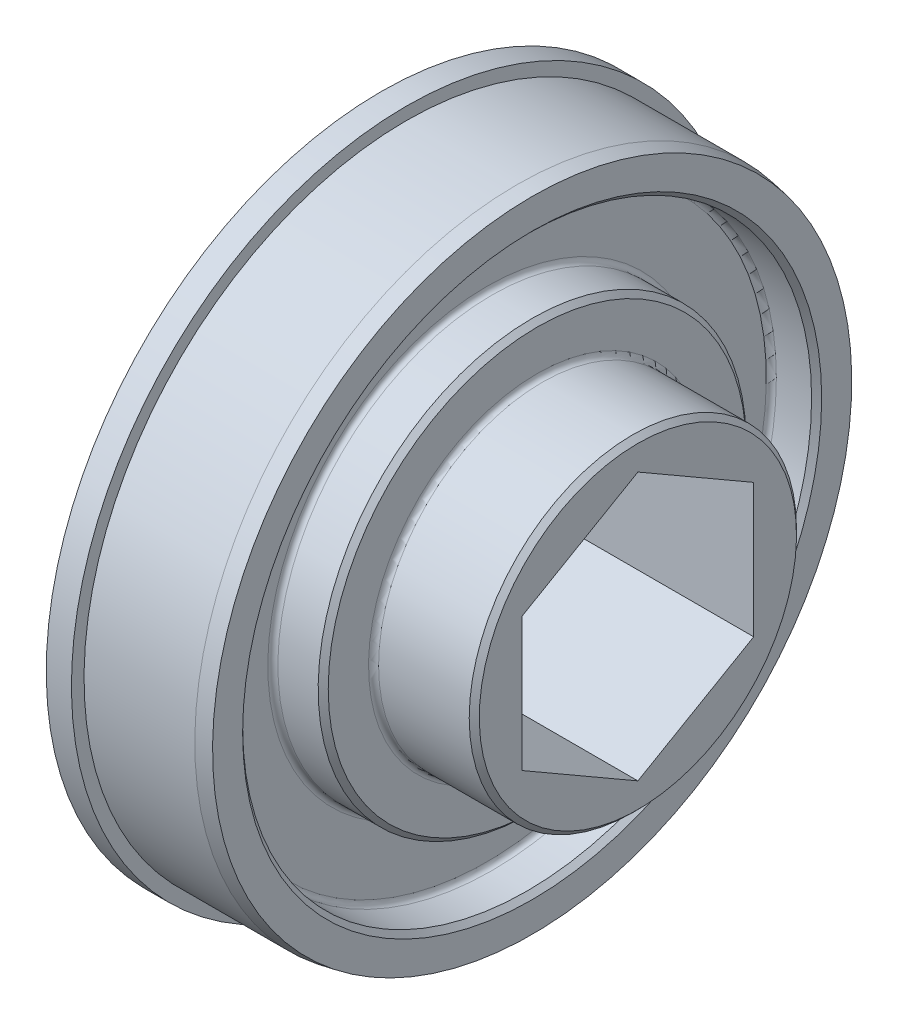
ISO-10303-21;
HEADER;
FILE_DESCRIPTION(('STEP AP214'),'2;1');
FILE_NAME('part.step','',(''),(''),'','','');
FILE_SCHEMA(('AUTOMOTIVE_DESIGN { 1 0 10303 214 1 1 1 1 }'));
ENDSEC;
DATA;
#1=APPLICATION_CONTEXT('core data for automotive mechanical design processes');
#2=APPLICATION_PROTOCOL_DEFINITION('international standard','automotive_design',2000,#1);
#3=PRODUCT_CONTEXT('',#1,'mechanical');
#4=PRODUCT('Part','Part','',(#3));
#5=PRODUCT_RELATED_PRODUCT_CATEGORY('part','',(#4));
#6=PRODUCT_DEFINITION_FORMATION('','',#4);
#7=PRODUCT_DEFINITION_CONTEXT('part definition',#1,'design');
#8=PRODUCT_DEFINITION('design','',#6,#7);
#9=PRODUCT_DEFINITION_SHAPE('','',#8);
#10=(LENGTH_UNIT() NAMED_UNIT(*) SI_UNIT(.MILLI.,.METRE.));
#11=(NAMED_UNIT(*) PLANE_ANGLE_UNIT() SI_UNIT($,.RADIAN.));
#12=(NAMED_UNIT(*) SI_UNIT($,.STERADIAN.) SOLID_ANGLE_UNIT());
#13=UNCERTAINTY_MEASURE_WITH_UNIT(LENGTH_MEASURE(1.E-05),#10,'distance_accuracy_value','');
#14=(GEOMETRIC_REPRESENTATION_CONTEXT(3) GLOBAL_UNCERTAINTY_ASSIGNED_CONTEXT((#13)) GLOBAL_UNIT_ASSIGNED_CONTEXT((#10,
#11,#12)) REPRESENTATION_CONTEXT('',''));
#15=CARTESIAN_POINT('',(0.,0.,0.));
#16=DIRECTION('',(0.,0.,1.));
#17=DIRECTION('',(1.,0.,0.));
#18=AXIS2_PLACEMENT_3D('',#15,#16,#17);
#19=CARTESIAN_POINT('',(0.,31.5,0.));
#20=DIRECTION('',(1.,0.,0.));
#21=DIRECTION('',(0.,1.,0.));
#22=AXIS2_PLACEMENT_3D('',#19,#20,#21);
#23=PLANE('',#22);
#24=DIRECTION('',(0.,0.5,0.866025403784439));
#25=VECTOR('',#24,1.);
#26=CARTESIAN_POINT('',(0.,13.2790561913614,-23.));
#27=LINE('',#26,#25);
#28=CARTESIAN_POINT('',(0.,13.2790561913614,-23.));
#29=VERTEX_POINT('',#28);
#30=CARTESIAN_POINT('',(0.,26.5581123827228,0.));
#31=VERTEX_POINT('',#30);
#32=EDGE_CURVE('E50',#29,#31,#27,.T.);
#33=ORIENTED_EDGE('',*,*,#32,.F.);
#34=DIRECTION('',(0.,1.,0.));
#35=VECTOR('',#34,1.);
#36=CARTESIAN_POINT('',(0.,-13.2790561913614,-23.));
#37=LINE('',#36,#35);
#38=CARTESIAN_POINT('',(0.,-13.2790561913614,-23.));
#39=VERTEX_POINT('',#38);
#40=EDGE_CURVE('E114',#39,#29,#37,.T.);
#41=ORIENTED_EDGE('',*,*,#40,.F.);
#42=DIRECTION('',(0.,0.5,-0.866025403784439));
#43=VECTOR('',#42,1.);
#44=CARTESIAN_POINT('',(0.,-26.5581123827228,0.));
#45=LINE('',#44,#43);
#46=CARTESIAN_POINT('',(0.,-26.5581123827228,0.));
#47=VERTEX_POINT('',#46);
#48=EDGE_CURVE('E108',#47,#39,#45,.T.);
#49=ORIENTED_EDGE('',*,*,#48,.F.);
#50=DIRECTION('',(0.,-0.5,-0.866025403784438));
#51=VECTOR('',#50,1.);
#52=CARTESIAN_POINT('',(0.,-13.2790561913614,23.));
#53=LINE('',#52,#51);
#54=CARTESIAN_POINT('',(0.,-13.2790561913614,23.));
#55=VERTEX_POINT('',#54);
#56=EDGE_CURVE('E106',#55,#47,#53,.T.);
#57=ORIENTED_EDGE('',*,*,#56,.F.);
#58=DIRECTION('',(0.,-1.,0.));
#59=VECTOR('',#58,1.);
#60=CARTESIAN_POINT('',(0.,13.2790561913614,23.));
#61=LINE('',#60,#59);
#62=CARTESIAN_POINT('',(0.,13.2790561913614,23.));
#63=VERTEX_POINT('',#62);
#64=EDGE_CURVE('E90',#63,#55,#61,.T.);
#65=ORIENTED_EDGE('',*,*,#64,.F.);
#66=DIRECTION('',(0.,-0.5,0.866025403784439));
#67=VECTOR('',#66,1.);
#68=CARTESIAN_POINT('',(0.,26.5581123827228,0.));
#69=LINE('',#68,#67);
#70=EDGE_CURVE('E99',#31,#63,#69,.T.);
#71=ORIENTED_EDGE('',*,*,#70,.F.);
#72=EDGE_LOOP('',(#33,#41,#49,#57,#65,#71));
#73=FACE_BOUND('',#72,.T.);
#74=CARTESIAN_POINT('',(0.,0.,0.));
#75=DIRECTION('',(1.,0.,0.));
#76=DIRECTION('',(0.,1.,0.));
#77=AXIS2_PLACEMENT_3D('',#74,#75,#76);
#78=CIRCLE('',#77,31.5);
#79=CARTESIAN_POINT('',(0.,31.5,0.));
#80=VERTEX_POINT('',#79);
#81=EDGE_CURVE('E215',#80,#80,#78,.T.);
#82=ORIENTED_EDGE('',*,*,#81,.T.);
#83=EDGE_LOOP('',(#82));
#84=FACE_BOUND('',#83,.T.);
#85=ADVANCED_FACE('F36',(#73,#84),#23,.T.);
#86=CARTESIAN_POINT('',(0.,0.,0.));
#87=DIRECTION('',(-1.,0.,0.));
#88=DIRECTION('',(0.,-1.,0.));
#89=AXIS2_PLACEMENT_3D('',#86,#87,#88);
#90=CONICAL_SURFACE('',#89,31.5,0.785398163397447);
#91=CARTESIAN_POINT('',(-0.999999999999992,0.,0.));
#92=DIRECTION('',(1.,0.,0.));
#93=DIRECTION('',(0.,1.,0.));
#94=AXIS2_PLACEMENT_3D('',#91,#92,#93);
#95=CIRCLE('',#94,32.5);
#96=CARTESIAN_POINT('',(-0.999999999999997,32.5,0.));
#97=VERTEX_POINT('',#96);
#98=EDGE_CURVE('E212',#97,#97,#95,.T.);
#99=ORIENTED_EDGE('',*,*,#98,.T.);
#100=EDGE_LOOP('',(#99));
#101=FACE_BOUND('',#100,.T.);
#102=ORIENTED_EDGE('',*,*,#81,.F.);
#103=EDGE_LOOP('',(#102));
#104=FACE_BOUND('',#103,.T.);
#105=ADVANCED_FACE('F250',(#101,#104),#90,.T.);
#106=CARTESIAN_POINT('',(0.,0.,0.));
#107=DIRECTION('',(1.,0.,0.));
#108=DIRECTION('',(0.,1.,0.));
#109=AXIS2_PLACEMENT_3D('',#106,#107,#108);
#110=CYLINDRICAL_SURFACE('',#109,32.5);
#111=CARTESIAN_POINT('',(-19.,0.,0.));
#112=DIRECTION('',(1.,0.,0.));
#113=DIRECTION('',(0.,1.,0.));
#114=AXIS2_PLACEMENT_3D('',#111,#112,#113);
#115=CIRCLE('',#114,32.5);
#116=CARTESIAN_POINT('',(-19.,32.5,0.));
#117=VERTEX_POINT('',#116);
#118=EDGE_CURVE('E209',#117,#117,#115,.T.);
#119=ORIENTED_EDGE('',*,*,#118,.T.);
#120=EDGE_LOOP('',(#119));
#121=FACE_BOUND('',#120,.T.);
#122=ORIENTED_EDGE('',*,*,#98,.F.);
#123=EDGE_LOOP('',(#122));
#124=FACE_BOUND('',#123,.T.);
#125=ADVANCED_FACE('F254',(#121,#124),#110,.T.);
#126=CARTESIAN_POINT('',(-19.,0.,0.));
#127=DIRECTION('',(1.,0.,0.));
#128=DIRECTION('',(0.,1.,0.));
#129=AXIS2_PLACEMENT_3D('',#126,#127,#128);
#130=TOROIDAL_SURFACE('',#129,33.5,1.);
#131=CARTESIAN_POINT('',(-20.,0.,0.));
#132=DIRECTION('',(1.,0.,0.));
#133=DIRECTION('',(0.,1.,0.));
#134=AXIS2_PLACEMENT_3D('',#131,#132,#133);
#135=CIRCLE('',#134,33.5);
#136=CARTESIAN_POINT('',(-20.,33.5,0.));
#137=VERTEX_POINT('',#136);
#138=EDGE_CURVE('E206',#137,#137,#135,.T.);
#139=ORIENTED_EDGE('',*,*,#138,.T.);
#140=EDGE_LOOP('',(#139));
#141=FACE_BOUND('',#140,.T.);
#142=ORIENTED_EDGE('',*,*,#118,.F.);
#143=EDGE_LOOP('',(#142));
#144=FACE_BOUND('',#143,.T.);
#145=ADVANCED_FACE('F259',(#141,#144),#130,.F.);
#146=CARTESIAN_POINT('',(-20.,41.5,0.));
#147=DIRECTION('',(1.,0.,0.));
#148=DIRECTION('',(0.,1.,0.));
#149=AXIS2_PLACEMENT_3D('',#146,#147,#148);
#150=PLANE('',#149);
#151=CARTESIAN_POINT('',(-20.,0.,0.));
#152=DIRECTION('',(1.,0.,0.));
#153=DIRECTION('',(0.,1.,0.));
#154=AXIS2_PLACEMENT_3D('',#151,#152,#153);
#155=CIRCLE('',#154,41.5);
#156=CARTESIAN_POINT('',(-20.,41.5,0.));
#157=VERTEX_POINT('',#156);
#158=EDGE_CURVE('E203',#157,#157,#155,.T.);
#159=ORIENTED_EDGE('',*,*,#158,.T.);
#160=EDGE_LOOP('',(#159));
#161=FACE_BOUND('',#160,.T.);
#162=ORIENTED_EDGE('',*,*,#138,.F.);
#163=EDGE_LOOP('',(#162));
#164=FACE_BOUND('',#163,.T.);
#165=ADVANCED_FACE('F266',(#161,#164),#150,.T.);
#166=CARTESIAN_POINT('',(-20.,0.,0.));
#167=DIRECTION('',(-1.,0.,0.));
#168=DIRECTION('',(0.,-1.,0.));
#169=AXIS2_PLACEMENT_3D('',#166,#167,#168);
#170=CONICAL_SURFACE('',#169,41.5,0.785398163397443);
#171=CARTESIAN_POINT('',(-21.,0.,0.));
#172=DIRECTION('',(1.,0.,0.));
#173=DIRECTION('',(0.,1.,0.));
#174=AXIS2_PLACEMENT_3D('',#171,#172,#173);
#175=CIRCLE('',#174,42.5);
#176=CARTESIAN_POINT('',(-21.,42.5,0.));
#177=VERTEX_POINT('',#176);
#178=EDGE_CURVE('E200',#177,#177,#175,.T.);
#179=ORIENTED_EDGE('',*,*,#178,.T.);
#180=EDGE_LOOP('',(#179));
#181=FACE_BOUND('',#180,.T.);
#182=ORIENTED_EDGE('',*,*,#158,.F.);
#183=EDGE_LOOP('',(#182));
#184=FACE_BOUND('',#183,.T.);
#185=ADVANCED_FACE('F270',(#181,#184),#170,.T.);
#186=CARTESIAN_POINT('',(0.,0.,0.));
#187=DIRECTION('',(1.,0.,0.));
#188=DIRECTION('',(0.,1.,0.));
#189=AXIS2_PLACEMENT_3D('',#186,#187,#188);
#190=CYLINDRICAL_SURFACE('',#189,42.5);
#191=CARTESIAN_POINT('',(-29.,0.,0.));
#192=DIRECTION('',(1.,0.,0.));
#193=DIRECTION('',(0.,1.,0.));
#194=AXIS2_PLACEMENT_3D('',#191,#192,#193);
#195=CIRCLE('',#194,42.5);
#196=CARTESIAN_POINT('',(-29.,42.5,0.));
#197=VERTEX_POINT('',#196);
#198=EDGE_CURVE('E197',#197,#197,#195,.T.);
#199=ORIENTED_EDGE('',*,*,#198,.T.);
#200=EDGE_LOOP('',(#199));
#201=FACE_BOUND('',#200,.T.);
#202=ORIENTED_EDGE('',*,*,#178,.F.);
#203=EDGE_LOOP('',(#202));
#204=FACE_BOUND('',#203,.T.);
#205=ADVANCED_FACE('F274',(#201,#204),#190,.T.);
#206=CARTESIAN_POINT('',(-29.,0.,0.));
#207=DIRECTION('',(1.,0.,0.));
#208=DIRECTION('',(0.,1.,0.));
#209=AXIS2_PLACEMENT_3D('',#206,#207,#208);
#210=TOROIDAL_SURFACE('',#209,43.5,1.);
#211=CARTESIAN_POINT('',(-30.,0.,0.));
#212=DIRECTION('',(1.,0.,0.));
#213=DIRECTION('',(0.,1.,0.));
#214=AXIS2_PLACEMENT_3D('',#211,#212,#213);
#215=CIRCLE('',#214,43.5);
#216=CARTESIAN_POINT('',(-30.,43.5,0.));
#217=VERTEX_POINT('',#216);
#218=EDGE_CURVE('E194',#217,#217,#215,.T.);
#219=ORIENTED_EDGE('',*,*,#218,.T.);
#220=EDGE_LOOP('',(#219));
#221=FACE_BOUND('',#220,.T.);
#222=ORIENTED_EDGE('',*,*,#198,.F.);
#223=EDGE_LOOP('',(#222));
#224=FACE_BOUND('',#223,.T.);
#225=ADVANCED_FACE('F278',(#221,#224),#210,.F.);
#226=CARTESIAN_POINT('',(-30.,55.5,0.));
#227=DIRECTION('',(1.,0.,0.));
#228=DIRECTION('',(0.,1.,0.));
#229=AXIS2_PLACEMENT_3D('',#226,#227,#228);
#230=PLANE('',#229);
#231=CARTESIAN_POINT('',(-30.,0.,0.));
#232=DIRECTION('',(1.,0.,0.));
#233=DIRECTION('',(0.,1.,0.));
#234=AXIS2_PLACEMENT_3D('',#231,#232,#233);
#235=CIRCLE('',#234,55.5);
#236=CARTESIAN_POINT('',(-30.,55.5,0.));
#237=VERTEX_POINT('',#236);
#238=EDGE_CURVE('E191',#237,#237,#235,.T.);
#239=ORIENTED_EDGE('',*,*,#238,.T.);
#240=EDGE_LOOP('',(#239));
#241=FACE_BOUND('',#240,.T.);
#242=ORIENTED_EDGE('',*,*,#218,.F.);
#243=EDGE_LOOP('',(#242));
#244=FACE_BOUND('',#243,.T.);
#245=ADVANCED_FACE('F282',(#241,#244),#230,.T.);
#246=CARTESIAN_POINT('',(-29.,0.,0.));
#247=DIRECTION('',(1.,0.,0.));
#248=DIRECTION('',(0.,1.,0.));
#249=AXIS2_PLACEMENT_3D('',#246,#247,#248);
#250=TOROIDAL_SURFACE('',#249,55.5,1.);
#251=CARTESIAN_POINT('',(-29.,0.,0.));
#252=DIRECTION('',(1.,0.,0.));
#253=DIRECTION('',(0.,1.,0.));
#254=AXIS2_PLACEMENT_3D('',#251,#252,#253);
#255=CIRCLE('',#254,56.5);
#256=CARTESIAN_POINT('',(-29.,56.5,0.));
#257=VERTEX_POINT('',#256);
#258=EDGE_CURVE('E188',#257,#257,#255,.T.);
#259=ORIENTED_EDGE('',*,*,#258,.T.);
#260=EDGE_LOOP('',(#259));
#261=FACE_BOUND('',#260,.T.);
#262=ORIENTED_EDGE('',*,*,#238,.F.);
#263=EDGE_LOOP('',(#262));
#264=FACE_BOUND('',#263,.T.);
#265=ADVANCED_FACE('F286',(#261,#264),#250,.F.);
#266=CARTESIAN_POINT('',(0.,0.,0.));
#267=DIRECTION('',(1.,0.,0.));
#268=DIRECTION('',(0.,1.,0.));
#269=AXIS2_PLACEMENT_3D('',#266,#267,#268);
#270=CYLINDRICAL_SURFACE('',#269,56.5);
#271=CARTESIAN_POINT('',(-22.,0.,0.));
#272=DIRECTION('',(1.,0.,0.));
#273=DIRECTION('',(0.,1.,0.));
#274=AXIS2_PLACEMENT_3D('',#271,#272,#273);
#275=CIRCLE('',#274,56.5);
#276=CARTESIAN_POINT('',(-22.,56.5,0.));
#277=VERTEX_POINT('',#276);
#278=EDGE_CURVE('E185',#277,#277,#275,.T.);
#279=ORIENTED_EDGE('',*,*,#278,.T.);
#280=EDGE_LOOP('',(#279));
#281=FACE_BOUND('',#280,.T.);
#282=ORIENTED_EDGE('',*,*,#258,.F.);
#283=EDGE_LOOP('',(#282));
#284=FACE_BOUND('',#283,.T.);
#285=ADVANCED_FACE('F290',(#281,#284),#270,.F.);
#286=CARTESIAN_POINT('',(-22.,0.,0.));
#287=DIRECTION('',(1.,0.,0.));
#288=DIRECTION('',(0.,1.,0.));
#289=AXIS2_PLACEMENT_3D('',#286,#287,#288);
#290=CONICAL_SURFACE('',#289,56.5,0.785398163397445);
#291=CARTESIAN_POINT('',(-21.,0.,0.));
#292=DIRECTION('',(1.,0.,0.));
#293=DIRECTION('',(0.,1.,0.));
#294=AXIS2_PLACEMENT_3D('',#291,#292,#293);
#295=CIRCLE('',#294,57.5);
#296=CARTESIAN_POINT('',(-21.,57.5,0.));
#297=VERTEX_POINT('',#296);
#298=EDGE_CURVE('E182',#297,#297,#295,.T.);
#299=ORIENTED_EDGE('',*,*,#298,.T.);
#300=EDGE_LOOP('',(#299));
#301=FACE_BOUND('',#300,.T.);
#302=ORIENTED_EDGE('',*,*,#278,.F.);
#303=EDGE_LOOP('',(#302));
#304=FACE_BOUND('',#303,.T.);
#305=ADVANCED_FACE('F294',(#301,#304),#290,.F.);
#306=CARTESIAN_POINT('',(-21.,63.4710190578746,0.));
#307=DIRECTION('',(1.,0.,0.));
#308=DIRECTION('',(0.,1.,0.));
#309=AXIS2_PLACEMENT_3D('',#306,#307,#308);
#310=PLANE('',#309);
#311=CARTESIAN_POINT('',(-21.,0.,0.));
#312=DIRECTION('',(1.,0.,0.));
#313=DIRECTION('',(0.,1.,0.));
#314=AXIS2_PLACEMENT_3D('',#311,#312,#313);
#315=CIRCLE('',#314,63.4710190578746);
#316=CARTESIAN_POINT('',(-21.,63.4710190578746,0.));
#317=VERTEX_POINT('',#316);
#318=EDGE_CURVE('E179',#317,#317,#315,.T.);
#319=ORIENTED_EDGE('',*,*,#318,.T.);
#320=EDGE_LOOP('',(#319));
#321=FACE_BOUND('',#320,.T.);
#322=ORIENTED_EDGE('',*,*,#298,.F.);
#323=EDGE_LOOP('',(#322));
#324=FACE_BOUND('',#323,.T.);
#325=ADVANCED_FACE('F298',(#321,#324),#310,.T.);
#326=CARTESIAN_POINT('',(-21.,0.,0.));
#327=DIRECTION('',(-1.,0.,0.));
#328=DIRECTION('',(0.,-1.,0.));
#329=AXIS2_PLACEMENT_3D('',#326,#327,#328);
#330=CONICAL_SURFACE('',#329,63.4710190578746,0.174532925199431);
#331=CARTESIAN_POINT('',(-24.,0.,0.));
#332=DIRECTION('',(1.,0.,0.));
#333=DIRECTION('',(0.,1.,0.));
#334=AXIS2_PLACEMENT_3D('',#331,#332,#333);
#335=CIRCLE('',#334,64.);
#336=CARTESIAN_POINT('',(-24.,64.,0.));
#337=VERTEX_POINT('',#336);
#338=EDGE_CURVE('E176',#337,#337,#335,.T.);
#339=ORIENTED_EDGE('',*,*,#338,.T.);
#340=EDGE_LOOP('',(#339));
#341=FACE_BOUND('',#340,.T.);
#342=ORIENTED_EDGE('',*,*,#318,.F.);
#343=EDGE_LOOP('',(#342));
#344=FACE_BOUND('',#343,.T.);
#345=ADVANCED_FACE('F302',(#341,#344),#330,.T.);
#346=CARTESIAN_POINT('',(0.,0.,0.));
#347=DIRECTION('',(1.,0.,0.));
#348=DIRECTION('',(0.,1.,0.));
#349=AXIS2_PLACEMENT_3D('',#346,#347,#348);
#350=CYLINDRICAL_SURFACE('',#349,64.);
#351=CARTESIAN_POINT('',(-46.,0.,0.));
#352=DIRECTION('',(1.,0.,0.));
#353=DIRECTION('',(0.,1.,0.));
#354=AXIS2_PLACEMENT_3D('',#351,#352,#353);
#355=CIRCLE('',#354,64.);
#356=CARTESIAN_POINT('',(-46.,64.,0.));
#357=VERTEX_POINT('',#356);
#358=EDGE_CURVE('E173',#357,#357,#355,.T.);
#359=ORIENTED_EDGE('',*,*,#358,.T.);
#360=EDGE_LOOP('',(#359));
#361=FACE_BOUND('',#360,.T.);
#362=ORIENTED_EDGE('',*,*,#338,.F.);
#363=EDGE_LOOP('',(#362));
#364=FACE_BOUND('',#363,.T.);
#365=ADVANCED_FACE('F306',(#361,#364),#350,.T.);
#366=CARTESIAN_POINT('',(-46.,66.5,0.));
#367=DIRECTION('',(1.,0.,0.));
#368=DIRECTION('',(0.,1.,0.));
#369=AXIS2_PLACEMENT_3D('',#366,#367,#368);
#370=PLANE('',#369);
#371=CARTESIAN_POINT('',(-46.,0.,0.));
#372=DIRECTION('',(1.,0.,0.));
#373=DIRECTION('',(0.,1.,0.));
#374=AXIS2_PLACEMENT_3D('',#371,#372,#373);
#375=CIRCLE('',#374,66.5);
#376=CARTESIAN_POINT('',(-46.,66.5,0.));
#377=VERTEX_POINT('',#376);
#378=EDGE_CURVE('E170',#377,#377,#375,.T.);
#379=ORIENTED_EDGE('',*,*,#378,.T.);
#380=EDGE_LOOP('',(#379));
#381=FACE_BOUND('',#380,.T.);
#382=ORIENTED_EDGE('',*,*,#358,.F.);
#383=EDGE_LOOP('',(#382));
#384=FACE_BOUND('',#383,.T.);
#385=ADVANCED_FACE('F310',(#381,#384),#370,.T.);
#386=CARTESIAN_POINT('',(0.,0.,0.));
#387=DIRECTION('',(1.,0.,0.));
#388=DIRECTION('',(0.,1.,0.));
#389=AXIS2_PLACEMENT_3D('',#386,#387,#388);
#390=CYLINDRICAL_SURFACE('',#389,66.5);
#391=CARTESIAN_POINT('',(-51.,0.,0.));
#392=DIRECTION('',(1.,0.,0.));
#393=DIRECTION('',(0.,1.,0.));
#394=AXIS2_PLACEMENT_3D('',#391,#392,#393);
#395=CIRCLE('',#394,66.5);
#396=CARTESIAN_POINT('',(-51.,66.5,0.));
#397=VERTEX_POINT('',#396);
#398=EDGE_CURVE('E167',#397,#397,#395,.T.);
#399=ORIENTED_EDGE('',*,*,#398,.T.);
#400=EDGE_LOOP('',(#399));
#401=FACE_BOUND('',#400,.T.);
#402=ORIENTED_EDGE('',*,*,#378,.F.);
#403=EDGE_LOOP('',(#402));
#404=FACE_BOUND('',#403,.T.);
#405=ADVANCED_FACE('F314',(#401,#404),#390,.T.);
#406=CARTESIAN_POINT('',(-51.,57.5,0.));
#407=DIRECTION('',(-1.,0.,0.));
#408=DIRECTION('',(0.,-1.,0.));
#409=AXIS2_PLACEMENT_3D('',#406,#407,#408);
#410=PLANE('',#409);
#411=CARTESIAN_POINT('',(-51.,0.,0.));
#412=DIRECTION('',(1.,0.,0.));
#413=DIRECTION('',(0.,1.,0.));
#414=AXIS2_PLACEMENT_3D('',#411,#412,#413);
#415=CIRCLE('',#414,57.5);
#416=CARTESIAN_POINT('',(-51.,57.5,0.));
#417=VERTEX_POINT('',#416);
#418=EDGE_CURVE('E164',#417,#417,#415,.T.);
#419=ORIENTED_EDGE('',*,*,#418,.T.);
#420=EDGE_LOOP('',(#419));
#421=FACE_BOUND('',#420,.T.);
#422=ORIENTED_EDGE('',*,*,#398,.F.);
#423=EDGE_LOOP('',(#422));
#424=FACE_BOUND('',#423,.T.);
#425=ADVANCED_FACE('F318',(#421,#424),#410,.T.);
#426=CARTESIAN_POINT('',(-51.,0.,0.));
#427=DIRECTION('',(-1.,0.,0.));
#428=DIRECTION('',(0.,-1.,0.));
#429=AXIS2_PLACEMENT_3D('',#426,#427,#428);
#430=CONICAL_SURFACE('',#429,57.5,0.785398163397438);
#431=CARTESIAN_POINT('',(-50.,0.,0.));
#432=DIRECTION('',(1.,0.,0.));
#433=DIRECTION('',(0.,1.,0.));
#434=AXIS2_PLACEMENT_3D('',#431,#432,#433);
#435=CIRCLE('',#434,56.5);
#436=CARTESIAN_POINT('',(-50.,56.5,0.));
#437=VERTEX_POINT('',#436);
#438=EDGE_CURVE('E161',#437,#437,#435,.T.);
#439=ORIENTED_EDGE('',*,*,#438,.T.);
#440=EDGE_LOOP('',(#439));
#441=FACE_BOUND('',#440,.T.);
#442=ORIENTED_EDGE('',*,*,#418,.F.);
#443=EDGE_LOOP('',(#442));
#444=FACE_BOUND('',#443,.T.);
#445=ADVANCED_FACE('F322',(#441,#444),#430,.F.);
#446=CARTESIAN_POINT('',(0.,0.,0.));
#447=DIRECTION('',(1.,0.,0.));
#448=DIRECTION('',(0.,1.,0.));
#449=AXIS2_PLACEMENT_3D('',#446,#447,#448);
#450=CYLINDRICAL_SURFACE('',#449,56.5);
#451=CARTESIAN_POINT('',(-43.,0.,0.));
#452=DIRECTION('',(1.,0.,0.));
#453=DIRECTION('',(0.,1.,0.));
#454=AXIS2_PLACEMENT_3D('',#451,#452,#453);
#455=CIRCLE('',#454,56.5);
#456=CARTESIAN_POINT('',(-43.,56.5,0.));
#457=VERTEX_POINT('',#456);
#458=EDGE_CURVE('E158',#457,#457,#455,.T.);
#459=ORIENTED_EDGE('',*,*,#458,.T.);
#460=EDGE_LOOP('',(#459));
#461=FACE_BOUND('',#460,.T.);
#462=ORIENTED_EDGE('',*,*,#438,.F.);
#463=EDGE_LOOP('',(#462));
#464=FACE_BOUND('',#463,.T.);
#465=ADVANCED_FACE('F326',(#461,#464),#450,.F.);
#466=CARTESIAN_POINT('',(-43.,0.,0.));
#467=DIRECTION('',(1.,0.,0.));
#468=DIRECTION('',(0.,1.,0.));
#469=AXIS2_PLACEMENT_3D('',#466,#467,#468);
#470=TOROIDAL_SURFACE('',#469,55.5,1.);
#471=CARTESIAN_POINT('',(-42.,0.,0.));
#472=DIRECTION('',(1.,0.,0.));
#473=DIRECTION('',(0.,1.,0.));
#474=AXIS2_PLACEMENT_3D('',#471,#472,#473);
#475=CIRCLE('',#474,55.5);
#476=CARTESIAN_POINT('',(-42.,55.5,0.));
#477=VERTEX_POINT('',#476);
#478=EDGE_CURVE('E155',#477,#477,#475,.T.);
#479=ORIENTED_EDGE('',*,*,#478,.T.);
#480=EDGE_LOOP('',(#479));
#481=FACE_BOUND('',#480,.T.);
#482=ORIENTED_EDGE('',*,*,#458,.F.);
#483=EDGE_LOOP('',(#482));
#484=FACE_BOUND('',#483,.T.);
#485=ADVANCED_FACE('F330',(#481,#484),#470,.F.);
#486=CARTESIAN_POINT('',(-42.,43.5,0.));
#487=DIRECTION('',(-1.,0.,0.));
#488=DIRECTION('',(0.,-1.,0.));
#489=AXIS2_PLACEMENT_3D('',#486,#487,#488);
#490=PLANE('',#489);
#491=CARTESIAN_POINT('',(-42.,0.,0.));
#492=DIRECTION('',(1.,0.,0.));
#493=DIRECTION('',(0.,1.,0.));
#494=AXIS2_PLACEMENT_3D('',#491,#492,#493);
#495=CIRCLE('',#494,43.5);
#496=CARTESIAN_POINT('',(-42.,43.5,0.));
#497=VERTEX_POINT('',#496);
#498=EDGE_CURVE('E152',#497,#497,#495,.T.);
#499=ORIENTED_EDGE('',*,*,#498,.T.);
#500=EDGE_LOOP('',(#499));
#501=FACE_BOUND('',#500,.T.);
#502=ORIENTED_EDGE('',*,*,#478,.F.);
#503=EDGE_LOOP('',(#502));
#504=FACE_BOUND('',#503,.T.);
#505=ADVANCED_FACE('F334',(#501,#504),#490,.T.);
#506=CARTESIAN_POINT('',(-43.,0.,0.));
#507=DIRECTION('',(1.,0.,0.));
#508=DIRECTION('',(0.,1.,0.));
#509=AXIS2_PLACEMENT_3D('',#506,#507,#508);
#510=TOROIDAL_SURFACE('',#509,43.5,1.);
#511=CARTESIAN_POINT('',(-43.,0.,0.));
#512=DIRECTION('',(1.,0.,0.));
#513=DIRECTION('',(0.,1.,0.));
#514=AXIS2_PLACEMENT_3D('',#511,#512,#513);
#515=CIRCLE('',#514,42.5);
#516=CARTESIAN_POINT('',(-43.,42.5,0.));
#517=VERTEX_POINT('',#516);
#518=EDGE_CURVE('E149',#517,#517,#515,.T.);
#519=ORIENTED_EDGE('',*,*,#518,.T.);
#520=EDGE_LOOP('',(#519));
#521=FACE_BOUND('',#520,.T.);
#522=ORIENTED_EDGE('',*,*,#498,.F.);
#523=EDGE_LOOP('',(#522));
#524=FACE_BOUND('',#523,.T.);
#525=ADVANCED_FACE('F338',(#521,#524),#510,.F.);
#526=CARTESIAN_POINT('',(0.,0.,0.));
#527=DIRECTION('',(1.,0.,0.));
#528=DIRECTION('',(0.,1.,0.));
#529=AXIS2_PLACEMENT_3D('',#526,#527,#528);
#530=CYLINDRICAL_SURFACE('',#529,42.5);
#531=CARTESIAN_POINT('',(-51.,0.,0.));
#532=DIRECTION('',(1.,0.,0.));
#533=DIRECTION('',(0.,1.,0.));
#534=AXIS2_PLACEMENT_3D('',#531,#532,#533);
#535=CIRCLE('',#534,42.5);
#536=CARTESIAN_POINT('',(-51.,42.5,0.));
#537=VERTEX_POINT('',#536);
#538=EDGE_CURVE('E146',#537,#537,#535,.T.);
#539=ORIENTED_EDGE('',*,*,#538,.T.);
#540=EDGE_LOOP('',(#539));
#541=FACE_BOUND('',#540,.T.);
#542=ORIENTED_EDGE('',*,*,#518,.F.);
#543=EDGE_LOOP('',(#542));
#544=FACE_BOUND('',#543,.T.);
#545=ADVANCED_FACE('F342',(#541,#544),#530,.T.);
#546=CARTESIAN_POINT('',(-51.,0.,0.));
#547=DIRECTION('',(1.,0.,0.));
#548=DIRECTION('',(0.,1.,0.));
#549=AXIS2_PLACEMENT_3D('',#546,#547,#548);
#550=CONICAL_SURFACE('',#549,42.5,0.785398163397445);
#551=CARTESIAN_POINT('',(-52.,0.,0.));
#552=DIRECTION('',(1.,0.,0.));
#553=DIRECTION('',(0.,1.,0.));
#554=AXIS2_PLACEMENT_3D('',#551,#552,#553);
#555=CIRCLE('',#554,41.5);
#556=CARTESIAN_POINT('',(-52.,41.5,0.));
#557=VERTEX_POINT('',#556);
#558=EDGE_CURVE('E143',#557,#557,#555,.T.);
#559=ORIENTED_EDGE('',*,*,#558,.T.);
#560=EDGE_LOOP('',(#559));
#561=FACE_BOUND('',#560,.T.);
#562=ORIENTED_EDGE('',*,*,#538,.F.);
#563=EDGE_LOOP('',(#562));
#564=FACE_BOUND('',#563,.T.);
#565=ADVANCED_FACE('F346',(#561,#564),#550,.T.);
#566=CARTESIAN_POINT('',(-52.,33.5,0.));
#567=DIRECTION('',(-1.,0.,0.));
#568=DIRECTION('',(0.,-1.,0.));
#569=AXIS2_PLACEMENT_3D('',#566,#567,#568);
#570=PLANE('',#569);
#571=CARTESIAN_POINT('',(-52.,0.,0.));
#572=DIRECTION('',(1.,0.,0.));
#573=DIRECTION('',(0.,1.,0.));
#574=AXIS2_PLACEMENT_3D('',#571,#572,#573);
#575=CIRCLE('',#574,33.5);
#576=CARTESIAN_POINT('',(-52.,33.5,0.));
#577=VERTEX_POINT('',#576);
#578=EDGE_CURVE('E140',#577,#577,#575,.T.);
#579=ORIENTED_EDGE('',*,*,#578,.T.);
#580=EDGE_LOOP('',(#579));
#581=FACE_BOUND('',#580,.T.);
#582=ORIENTED_EDGE('',*,*,#558,.F.);
#583=EDGE_LOOP('',(#582));
#584=FACE_BOUND('',#583,.T.);
#585=ADVANCED_FACE('F350',(#581,#584),#570,.T.);
#586=CARTESIAN_POINT('',(-53.,0.,0.));
#587=DIRECTION('',(1.,0.,0.));
#588=DIRECTION('',(0.,1.,0.));
#589=AXIS2_PLACEMENT_3D('',#586,#587,#588);
#590=TOROIDAL_SURFACE('',#589,33.5,1.);
#591=CARTESIAN_POINT('',(-53.,0.,0.));
#592=DIRECTION('',(1.,0.,0.));
#593=DIRECTION('',(0.,1.,0.));
#594=AXIS2_PLACEMENT_3D('',#591,#592,#593);
#595=CIRCLE('',#594,32.5);
#596=CARTESIAN_POINT('',(-53.,32.5,0.));
#597=VERTEX_POINT('',#596);
#598=EDGE_CURVE('E137',#597,#597,#595,.T.);
#599=ORIENTED_EDGE('',*,*,#598,.T.);
#600=EDGE_LOOP('',(#599));
#601=FACE_BOUND('',#600,.T.);
#602=ORIENTED_EDGE('',*,*,#578,.F.);
#603=EDGE_LOOP('',(#602));
#604=FACE_BOUND('',#603,.T.);
#605=ADVANCED_FACE('F354',(#601,#604),#590,.F.);
#606=CARTESIAN_POINT('',(0.,0.,0.));
#607=DIRECTION('',(1.,0.,0.));
#608=DIRECTION('',(0.,1.,0.));
#609=AXIS2_PLACEMENT_3D('',#606,#607,#608);
#610=CYLINDRICAL_SURFACE('',#609,32.5);
#611=CARTESIAN_POINT('',(-71.,0.,0.));
#612=DIRECTION('',(1.,0.,0.));
#613=DIRECTION('',(0.,1.,0.));
#614=AXIS2_PLACEMENT_3D('',#611,#612,#613);
#615=CIRCLE('',#614,32.5);
#616=CARTESIAN_POINT('',(-71.,32.5,0.));
#617=VERTEX_POINT('',#616);
#618=EDGE_CURVE('E134',#617,#617,#615,.T.);
#619=ORIENTED_EDGE('',*,*,#618,.T.);
#620=EDGE_LOOP('',(#619));
#621=FACE_BOUND('',#620,.T.);
#622=ORIENTED_EDGE('',*,*,#598,.F.);
#623=EDGE_LOOP('',(#622));
#624=FACE_BOUND('',#623,.T.);
#625=ADVANCED_FACE('F358',(#621,#624),#610,.T.);
#626=CARTESIAN_POINT('',(-71.,0.,0.));
#627=DIRECTION('',(1.,0.,0.));
#628=DIRECTION('',(0.,1.,0.));
#629=AXIS2_PLACEMENT_3D('',#626,#627,#628);
#630=CONICAL_SURFACE('',#629,32.5,0.785398163397442);
#631=CARTESIAN_POINT('',(-72.,0.,0.));
#632=DIRECTION('',(1.,0.,0.));
#633=DIRECTION('',(0.,1.,0.));
#634=AXIS2_PLACEMENT_3D('',#631,#632,#633);
#635=CIRCLE('',#634,31.5);
#636=CARTESIAN_POINT('',(-72.,31.5,0.));
#637=VERTEX_POINT('',#636);
#638=EDGE_CURVE('E131',#637,#637,#635,.T.);
#639=ORIENTED_EDGE('',*,*,#638,.T.);
#640=EDGE_LOOP('',(#639));
#641=FACE_BOUND('',#640,.T.);
#642=ORIENTED_EDGE('',*,*,#618,.F.);
#643=EDGE_LOOP('',(#642));
#644=FACE_BOUND('',#643,.T.);
#645=ADVANCED_FACE('F362',(#641,#644),#630,.T.);
#646=CARTESIAN_POINT('',(-72.,27.5,0.));
#647=DIRECTION('',(-1.,0.,0.));
#648=DIRECTION('',(0.,-1.,0.));
#649=AXIS2_PLACEMENT_3D('',#646,#647,#648);
#650=PLANE('',#649);
#651=CARTESIAN_POINT('',(-72.,0.,0.));
#652=DIRECTION('',(1.,0.,0.));
#653=DIRECTION('',(0.,1.,0.));
#654=AXIS2_PLACEMENT_3D('',#651,#652,#653);
#655=CIRCLE('',#654,27.5);
#656=CARTESIAN_POINT('',(-72.,27.5,0.));
#657=VERTEX_POINT('',#656);
#658=EDGE_CURVE('E128',#657,#657,#655,.T.);
#659=ORIENTED_EDGE('',*,*,#658,.T.);
#660=EDGE_LOOP('',(#659));
#661=FACE_BOUND('',#660,.T.);
#662=ORIENTED_EDGE('',*,*,#638,.F.);
#663=EDGE_LOOP('',(#662));
#664=FACE_BOUND('',#663,.T.);
#665=ADVANCED_FACE('F366',(#661,#664),#650,.T.);
#666=CARTESIAN_POINT('',(0.,0.,0.));
#667=DIRECTION('',(1.,0.,0.));
#668=DIRECTION('',(0.,1.,0.));
#669=AXIS2_PLACEMENT_3D('',#666,#667,#668);
#670=CYLINDRICAL_SURFACE('',#669,27.5);
#671=CARTESIAN_POINT('',(-57.,0.,0.));
#672=DIRECTION('',(1.,0.,0.));
#673=DIRECTION('',(0.,1.,0.));
#674=AXIS2_PLACEMENT_3D('',#671,#672,#673);
#675=CIRCLE('',#674,27.5);
#676=CARTESIAN_POINT('',(-57.,27.5,0.));
#677=VERTEX_POINT('',#676);
#678=EDGE_CURVE('E119',#677,#677,#675,.T.);
#679=ORIENTED_EDGE('',*,*,#678,.T.);
#680=EDGE_LOOP('',(#679));
#681=FACE_BOUND('',#680,.T.);
#682=ORIENTED_EDGE('',*,*,#658,.F.);
#683=EDGE_LOOP('',(#682));
#684=FACE_BOUND('',#683,.T.);
#685=ADVANCED_FACE('F370',(#681,#684),#670,.F.);
#686=CARTESIAN_POINT('',(-57.,0.,0.));
#687=DIRECTION('',(-1.,0.,0.));
#688=DIRECTION('',(0.,-1.,0.));
#689=AXIS2_PLACEMENT_3D('',#686,#687,#688);
#690=PLANE('',#689);
#691=DIRECTION('',(0.,-0.5,-0.866025403784439));
#692=VECTOR('',#691,1.);
#693=CARTESIAN_POINT('',(-57.,19.9185842870421,-11.5));
#694=LINE('',#693,#692);
#695=CARTESIAN_POINT('',(-57.,26.5581123827228,0.));
#696=VERTEX_POINT('',#695);
#697=CARTESIAN_POINT('',(-57.,13.2790561913614,-23.));
#698=VERTEX_POINT('',#697);
#699=EDGE_CURVE('E11',#696,#698,#694,.T.);
#700=ORIENTED_EDGE('',*,*,#699,.F.);
#701=DIRECTION('',(0.,0.5,-0.866025403784439));
#702=VECTOR('',#701,1.);
#703=CARTESIAN_POINT('',(-57.,19.9185842870421,11.5));
#704=LINE('',#703,#702);
#705=CARTESIAN_POINT('',(-57.,13.2790561913614,23.));
#706=VERTEX_POINT('',#705);
#707=EDGE_CURVE('E218',#706,#696,#704,.T.);
#708=ORIENTED_EDGE('',*,*,#707,.F.);
#709=DIRECTION('',(0.,1.,0.));
#710=VECTOR('',#709,1.);
#711=CARTESIAN_POINT('',(-57.,0.,23.));
#712=LINE('',#711,#710);
#713=CARTESIAN_POINT('',(-57.,-13.2790561913614,23.));
#714=VERTEX_POINT('',#713);
#715=EDGE_CURVE('E93',#714,#706,#712,.T.);
#716=ORIENTED_EDGE('',*,*,#715,.F.);
#717=DIRECTION('',(0.,0.5,0.866025403784439));
#718=VECTOR('',#717,1.);
#719=CARTESIAN_POINT('',(-57.,-19.9185842870421,11.5));
#720=LINE('',#719,#718);
#721=CARTESIAN_POINT('',(-57.,-26.5581123827228,0.));
#722=VERTEX_POINT('',#721);
#723=EDGE_CURVE('E221',#722,#714,#720,.T.);
#724=ORIENTED_EDGE('',*,*,#723,.F.);
#725=DIRECTION('',(0.,-0.5,0.866025403784439));
#726=VECTOR('',#725,1.);
#727=CARTESIAN_POINT('',(-57.,-19.9185842870421,-11.5));
#728=LINE('',#727,#726);
#729=CARTESIAN_POINT('',(-57.,-13.2790561913614,-23.));
#730=VERTEX_POINT('',#729);
#731=EDGE_CURVE('E223',#730,#722,#728,.T.);
#732=ORIENTED_EDGE('',*,*,#731,.F.);
#733=DIRECTION('',(0.,-1.,0.));
#734=VECTOR('',#733,1.);
#735=CARTESIAN_POINT('',(-57.,0.,-23.));
#736=LINE('',#735,#734);
#737=EDGE_CURVE('E43',#698,#730,#736,.T.);
#738=ORIENTED_EDGE('',*,*,#737,.F.);
#739=EDGE_LOOP('',(#700,#708,#716,#724,#732,#738));
#740=FACE_BOUND('',#739,.T.);
#741=ORIENTED_EDGE('',*,*,#678,.F.);
#742=EDGE_LOOP('',(#741));
#743=FACE_BOUND('',#742,.T.);
#744=ADVANCED_FACE('F237',(#740,#743),#690,.T.);
#745=CARTESIAN_POINT('',(-72.,13.2790561913614,-23.));
#746=DIRECTION('',(0.,0.866025403784439,-0.5));
#747=DIRECTION('',(0.,0.5,0.866025403784439));
#748=AXIS2_PLACEMENT_3D('',#745,#746,#747);
#749=PLANE('',#748);
#750=ORIENTED_EDGE('',*,*,#699,.T.);
#751=DIRECTION('',(1.,0.,0.));
#752=VECTOR('',#751,1.);
#753=CARTESIAN_POINT('',(-72.,13.2790561913614,-23.));
#754=LINE('',#753,#752);
#755=EDGE_CURVE('E117',#698,#29,#754,.T.);
#756=ORIENTED_EDGE('',*,*,#755,.T.);
#757=ORIENTED_EDGE('',*,*,#32,.T.);
#758=DIRECTION('',(1.,0.,0.));
#759=VECTOR('',#758,1.);
#760=CARTESIAN_POINT('',(-72.,26.5581123827228,0.));
#761=LINE('',#760,#759);
#762=EDGE_CURVE('E96',#696,#31,#761,.T.);
#763=ORIENTED_EDGE('',*,*,#762,.F.);
#764=EDGE_LOOP('',(#750,#756,#757,#763));
#765=FACE_BOUND('',#764,.T.);
#766=ADVANCED_FACE('F377',(#765),#749,.F.);
#767=CARTESIAN_POINT('',(-72.,-13.2790561913614,-23.));
#768=DIRECTION('',(0.,0.,-1.));
#769=DIRECTION('',(-1.,0.,0.));
#770=AXIS2_PLACEMENT_3D('',#767,#768,#769);
#771=PLANE('',#770);
#772=ORIENTED_EDGE('',*,*,#737,.T.);
#773=DIRECTION('',(1.,0.,0.));
#774=VECTOR('',#773,1.);
#775=CARTESIAN_POINT('',(-72.,-13.2790561913614,-23.));
#776=LINE('',#775,#774);
#777=EDGE_CURVE('E120',#730,#39,#776,.T.);
#778=ORIENTED_EDGE('',*,*,#777,.T.);
#779=ORIENTED_EDGE('',*,*,#40,.T.);
#780=ORIENTED_EDGE('',*,*,#755,.F.);
#781=EDGE_LOOP('',(#772,#778,#779,#780));
#782=FACE_BOUND('',#781,.T.);
#783=ADVANCED_FACE('F228',(#782),#771,.F.);
#784=CARTESIAN_POINT('',(-72.,-26.5581123827228,0.));
#785=DIRECTION('',(0.,-0.866025403784439,-0.5));
#786=DIRECTION('',(0.,0.5,-0.866025403784439));
#787=AXIS2_PLACEMENT_3D('',#784,#785,#786);
#788=PLANE('',#787);
#789=ORIENTED_EDGE('',*,*,#731,.T.);
#790=DIRECTION('',(1.,0.,0.));
#791=VECTOR('',#790,1.);
#792=CARTESIAN_POINT('',(-72.,-26.5581123827228,0.));
#793=LINE('',#792,#791);
#794=EDGE_CURVE('E122',#722,#47,#793,.T.);
#795=ORIENTED_EDGE('',*,*,#794,.T.);
#796=ORIENTED_EDGE('',*,*,#48,.T.);
#797=ORIENTED_EDGE('',*,*,#777,.F.);
#798=EDGE_LOOP('',(#789,#795,#796,#797));
#799=FACE_BOUND('',#798,.T.);
#800=ADVANCED_FACE('F233',(#799),#788,.F.);
#801=CARTESIAN_POINT('',(-72.,-13.2790561913614,23.));
#802=DIRECTION('',(0.,-0.866025403784439,0.5));
#803=DIRECTION('',(0.,-0.5,-0.866025403784439));
#804=AXIS2_PLACEMENT_3D('',#801,#802,#803);
#805=PLANE('',#804);
#806=ORIENTED_EDGE('',*,*,#723,.T.);
#807=DIRECTION('',(1.,0.,0.));
#808=VECTOR('',#807,1.);
#809=CARTESIAN_POINT('',(-72.,-13.2790561913614,23.));
#810=LINE('',#809,#808);
#811=EDGE_CURVE('E95',#714,#55,#810,.T.);
#812=ORIENTED_EDGE('',*,*,#811,.T.);
#813=ORIENTED_EDGE('',*,*,#56,.T.);
#814=ORIENTED_EDGE('',*,*,#794,.F.);
#815=EDGE_LOOP('',(#806,#812,#813,#814));
#816=FACE_BOUND('',#815,.T.);
#817=ADVANCED_FACE('F240',(#816),#805,.F.);
#818=CARTESIAN_POINT('',(-72.,13.2790561913614,23.));
#819=DIRECTION('',(0.,0.,1.));
#820=DIRECTION('',(0.,-1.,0.));
#821=AXIS2_PLACEMENT_3D('',#818,#819,#820);
#822=PLANE('',#821);
#823=ORIENTED_EDGE('',*,*,#715,.T.);
#824=DIRECTION('',(1.,0.,0.));
#825=VECTOR('',#824,1.);
#826=CARTESIAN_POINT('',(-72.,13.2790561913614,23.));
#827=LINE('',#826,#825);
#828=EDGE_CURVE('E58',#706,#63,#827,.T.);
#829=ORIENTED_EDGE('',*,*,#828,.T.);
#830=ORIENTED_EDGE('',*,*,#64,.T.);
#831=ORIENTED_EDGE('',*,*,#811,.F.);
#832=EDGE_LOOP('',(#823,#829,#830,#831));
#833=FACE_BOUND('',#832,.T.);
#834=ADVANCED_FACE('F87',(#833),#822,.F.);
#835=CARTESIAN_POINT('',(-72.,26.5581123827228,0.));
#836=DIRECTION('',(0.,0.866025403784439,0.5));
#837=DIRECTION('',(0.,-0.5,0.866025403784439));
#838=AXIS2_PLACEMENT_3D('',#835,#836,#837);
#839=PLANE('',#838);
#840=ORIENTED_EDGE('',*,*,#707,.T.);
#841=ORIENTED_EDGE('',*,*,#762,.T.);
#842=ORIENTED_EDGE('',*,*,#70,.T.);
#843=ORIENTED_EDGE('',*,*,#828,.F.);
#844=EDGE_LOOP('',(#840,#841,#842,#843));
#845=FACE_BOUND('',#844,.T.);
#846=ADVANCED_FACE('F100',(#845),#839,.F.);
#847=CLOSED_SHELL('',(#85,#105,#125,#145,#165,#185,#205,#225,#245,#265,#285,#305,#325,#345,#365,
#385,#405,#425,#445,#465,#485,#505,#525,#545,#565,#585,#605,#625,#645,#665,#685,#744,#766,#783,
#800,#817,#834,#846));
#848=MANIFOLD_SOLID_BREP('B2',#847);
#849=ADVANCED_BREP_SHAPE_REPRESENTATION('',(#18,#848),#14);
#850=SHAPE_DEFINITION_REPRESENTATION(#9,#849);
ENDSEC;
END-ISO-10303-21;
